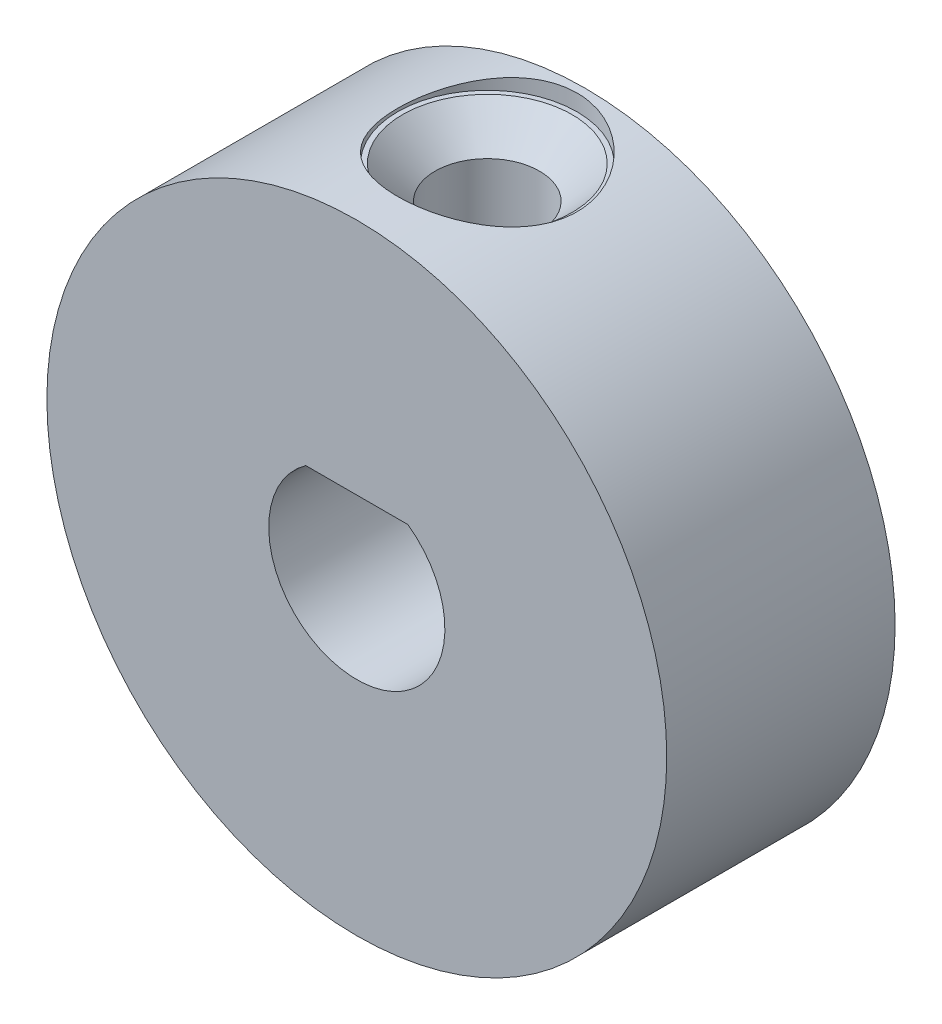
ISO-10303-21;
HEADER;
FILE_DESCRIPTION(('STEP AP214'),'2;1');
FILE_NAME('part.step','',(''),(''),'','','');
FILE_SCHEMA(('AUTOMOTIVE_DESIGN { 1 0 10303 214 1 1 1 1 }'));
ENDSEC;
DATA;
#1=APPLICATION_CONTEXT('core data for automotive mechanical design processes');
#2=APPLICATION_PROTOCOL_DEFINITION('international standard','automotive_design',2000,#1);
#3=PRODUCT_CONTEXT('',#1,'mechanical');
#4=PRODUCT('Part','Part','',(#3));
#5=PRODUCT_RELATED_PRODUCT_CATEGORY('part','',(#4));
#6=PRODUCT_DEFINITION_FORMATION('','',#4);
#7=PRODUCT_DEFINITION_CONTEXT('part definition',#1,'design');
#8=PRODUCT_DEFINITION('design','',#6,#7);
#9=PRODUCT_DEFINITION_SHAPE('','',#8);
#10=(LENGTH_UNIT() NAMED_UNIT(*) SI_UNIT(.MILLI.,.METRE.));
#11=(NAMED_UNIT(*) PLANE_ANGLE_UNIT() SI_UNIT($,.RADIAN.));
#12=(NAMED_UNIT(*) SI_UNIT($,.STERADIAN.) SOLID_ANGLE_UNIT());
#13=UNCERTAINTY_MEASURE_WITH_UNIT(LENGTH_MEASURE(1.E-05),#10,'distance_accuracy_value','');
#14=(GEOMETRIC_REPRESENTATION_CONTEXT(3) GLOBAL_UNCERTAINTY_ASSIGNED_CONTEXT((#13)) GLOBAL_UNIT_ASSIGNED_CONTEXT((#10,
#11,#12)) REPRESENTATION_CONTEXT('',''));
#15=CARTESIAN_POINT('',(0.,0.,0.));
#16=DIRECTION('',(0.,0.,1.));
#17=DIRECTION('',(1.,0.,0.));
#18=AXIS2_PLACEMENT_3D('',#15,#16,#17);
#19=CARTESIAN_POINT('',(0.,0.,7.));
#20=DIRECTION('',(0.,0.,-1.));
#21=DIRECTION('',(-1.,0.,0.));
#22=AXIS2_PLACEMENT_3D('',#19,#20,#21);
#23=CYLINDRICAL_SURFACE('',#22,9.5);
#24=CARTESIAN_POINT('',(0.,0.,0.));
#25=DIRECTION('',(0.,0.,1.));
#26=DIRECTION('',(1.,0.,0.));
#27=AXIS2_PLACEMENT_3D('',#24,#25,#26);
#28=CIRCLE('',#27,9.5);
#29=CARTESIAN_POINT('',(9.5,0.,0.));
#30=VERTEX_POINT('',#29);
#31=EDGE_CURVE('E208',#30,#30,#28,.T.);
#32=ORIENTED_EDGE('',*,*,#31,.T.);
#33=EDGE_LOOP('',(#32));
#34=FACE_BOUND('',#33,.T.);
#35=CARTESIAN_POINT('',(0.,0.,7.));
#36=DIRECTION('',(0.,0.,1.));
#37=DIRECTION('',(1.,0.,0.));
#38=AXIS2_PLACEMENT_3D('',#35,#36,#37);
#39=CIRCLE('',#38,9.5);
#40=CARTESIAN_POINT('',(9.5,0.,7.));
#41=VERTEX_POINT('',#40);
#42=EDGE_CURVE('E210',#41,#41,#39,.T.);
#43=ORIENTED_EDGE('',*,*,#42,.F.);
#44=EDGE_LOOP('',(#43));
#45=FACE_BOUND('',#44,.T.);
#46=CARTESIAN_POINT('',(0.,9.5,0.25));
#47=CARTESIAN_POINT('',(-0.151103684405143,9.49999832244704,0.250002458752218));
#48=CARTESIAN_POINT('',(-0.302232490543049,9.49636009363155,0.262495456649511));
#49=CARTESIAN_POINT('',(-0.600104468590065,9.48220118050608,0.312028709515903));
#50=CARTESIAN_POINT('',(-0.746846052747288,9.47167803530686,0.349077741658606));
#51=CARTESIAN_POINT('',(-1.0316032111177,9.44490511841537,0.446393629211872));
#52=CARTESIAN_POINT('',(-1.16963081556959,9.42866345486217,0.506627622481757));
#53=CARTESIAN_POINT('',(-1.43362680551052,9.39215081459137,0.648473022458029));
#54=CARTESIAN_POINT('',(-1.55959383673314,9.37187938616094,0.730086826040953));
#55=CARTESIAN_POINT('',(-1.79928390939948,9.3288679137925,0.91469178268505));
#56=CARTESIAN_POINT('',(-1.91263626798142,9.30607995192475,1.01815304781881));
#57=CARTESIAN_POINT('',(-2.12064810193771,9.26089657094852,1.24251316219742));
#58=CARTESIAN_POINT('',(-2.21530468820945,9.23850121299656,1.36341470154252));
#59=CARTESIAN_POINT('',(-2.3851412003241,9.1961374284627,1.62230141161262));
#60=CARTESIAN_POINT('',(-2.45987724499969,9.17622885775419,1.76058848836682));
#61=CARTESIAN_POINT('',(-2.58488523493734,9.14180519471755,2.04843649415717));
#62=CARTESIAN_POINT('',(-2.63516260005811,9.12728890766878,2.197994917057));
#63=CARTESIAN_POINT('',(-2.7085054649216,9.1057912455198,2.49999556608355));
#64=CARTESIAN_POINT('',(-2.73225075845377,9.09862204672375,2.65225898197182));
#65=CARTESIAN_POINT('',(-2.75397717672037,9.09207071188815,2.95876409294279));
#66=CARTESIAN_POINT('',(-2.751964064319,9.09268683405768,3.11300533781662));
#67=CARTESIAN_POINT('',(-2.72276662670944,9.10146952020892,3.4136343353565));
#68=CARTESIAN_POINT('',(-2.69642417137728,9.10938354042197,3.56011243495701));
#69=CARTESIAN_POINT('',(-2.62067211905444,9.13146312538767,3.84647458311347));
#70=CARTESIAN_POINT('',(-2.57126038727882,9.1456292686927,3.98635802009324));
#71=CARTESIAN_POINT('',(-2.45013108041961,9.17882509752256,4.25766325857888));
#72=CARTESIAN_POINT('',(-2.37813330895178,9.19791530942063,4.38895224019629));
#73=CARTESIAN_POINT('',(-2.21407061426739,9.23877807968907,4.63787169462001));
#74=CARTESIAN_POINT('',(-2.12200112000824,9.26055124857193,4.75549904682108));
#75=CARTESIAN_POINT('',(-1.91618685498144,9.3053597726663,4.97854309496557));
#76=CARTESIAN_POINT('',(-1.80174061950395,9.32841134979004,5.08331030255787));
#77=CARTESIAN_POINT('',(-1.55661714618187,9.37242908900899,5.27231056222138));
#78=CARTESIAN_POINT('',(-1.42593902284808,9.39339513722105,5.35654249329974));
#79=CARTESIAN_POINT('',(-1.15093833312675,9.43104916921502,5.50243927488955));
#80=CARTESIAN_POINT('',(-1.00654019019468,9.44771132340433,5.5639687806679));
#81=CARTESIAN_POINT('',(-0.708852909931513,9.47469408752444,5.66168204194399));
#82=CARTESIAN_POINT('',(-0.555566086357667,9.48501633971808,5.69787236154339));
#83=CARTESIAN_POINT('',(-0.249981074301841,9.49790021134739,5.74281889776173));
#84=CARTESIAN_POINT('',(-0.0978227914435444,9.50071098704387,5.75245622823781));
#85=CARTESIAN_POINT('',(0.205942559875614,9.49898138198389,5.74648095244813));
#86=CARTESIAN_POINT('',(0.357549694070776,9.4944419087673,5.73087146342335));
#87=CARTESIAN_POINT('',(0.65264277856964,9.47868434388847,5.67556180638035));
#88=CARTESIAN_POINT('',(0.796232011032956,9.46760695334969,5.6363688361761));
#89=CARTESIAN_POINT('',(1.0747718814908,9.44004611204558,5.5356080040606));
#90=CARTESIAN_POINT('',(1.20972150725606,9.42356202920441,5.47403752598896));
#91=CARTESIAN_POINT('',(1.47045331248785,9.3864531724936,5.32874017299851));
#92=CARTESIAN_POINT('',(1.59596781480529,9.36574512857691,5.24455478541087));
#93=CARTESIAN_POINT('',(1.83139177054953,9.32257224582277,5.05698055414273));
#94=CARTESIAN_POINT('',(1.94129756906272,9.30010699742409,4.95358722579485));
#95=CARTESIAN_POINT('',(2.14621104649743,9.25500783915003,4.72639898636426));
#96=CARTESIAN_POINT('',(2.24059318661215,9.2323936777625,4.60203477635806));
#97=CARTESIAN_POINT('',(2.40718239059994,9.19036893236844,4.3387444034156));
#98=CARTESIAN_POINT('',(2.47939018279239,9.17095824315312,4.19981871895396));
#99=CARTESIAN_POINT('',(2.59906135276599,9.13776453706624,3.91189403341437));
#100=CARTESIAN_POINT('',(2.64665229406024,9.12395259006895,3.76295157602129));
#101=CARTESIAN_POINT('',(2.71595633948743,9.10356585395778,3.45869839580935));
#102=CARTESIAN_POINT('',(2.73767754597492,9.09698879893803,3.30338968266267));
#103=CARTESIAN_POINT('',(2.75410126157507,9.09202893674775,2.99727899048027));
#104=CARTESIAN_POINT('',(2.74981852412952,9.09333835862443,2.84653569857242));
#105=CARTESIAN_POINT('',(2.7167557932435,9.10327026037628,2.54801799271784));
#106=CARTESIAN_POINT('',(2.68797665822233,9.11189248399127,2.40024347492305));
#107=CARTESIAN_POINT('',(2.6073723314937,9.13527934560716,2.11339133879243));
#108=CARTESIAN_POINT('',(2.5557982443584,9.14997694724351,1.97423729812608));
#109=CARTESIAN_POINT('',(2.43126245291443,9.18385041129181,1.7064469395777));
#110=CARTESIAN_POINT('',(2.35829688090384,9.20302708341754,1.57781252908836));
#111=CARTESIAN_POINT('',(2.19012593088046,9.24451630224843,1.3299592752244));
#112=CARTESIAN_POINT('',(2.09424562749779,9.26691363088848,1.21121254912153));
#113=CARTESIAN_POINT('',(1.88420411013172,9.31188982023244,0.991164814491644));
#114=CARTESIAN_POINT('',(1.77003826301004,9.33446872556291,0.889868240971169));
#115=CARTESIAN_POINT('',(1.5230110830886,9.37798262689348,0.704925509299319));
#116=CARTESIAN_POINT('',(1.38973368573323,9.39885802173931,0.621819693319833));
#117=CARTESIAN_POINT('',(1.11049416144361,9.43591993772834,0.479317097890563));
#118=CARTESIAN_POINT('',(0.964538760766351,9.45210892570754,0.41990783877487));
#119=CARTESIAN_POINT('',(0.683003090577126,9.47633414525845,0.332617401388523));
#120=CARTESIAN_POINT('',(0.548418661837662,9.48513842472122,0.301715738391637));
#121=CARTESIAN_POINT('',(0.275896149880622,9.49697170809105,0.260407369578417));
#122=CARTESIAN_POINT('',(0.137958545422953,9.50000153161564,0.249997755144881));
#123=CARTESIAN_POINT('',(0.,9.5,0.25));
#124=B_SPLINE_CURVE_WITH_KNOTS('',3,(#46,#47,#48,#49,#50,#51,#52,#53,#54,#55,#56,#57,#58,#59,
#60,#61,#62,#63,#64,#65,#66,#67,#68,#69,#70,#71,#72,#73,#74,#75,#76,#77,#78,#79,#80,#81,#82,#83,
#84,#85,#86,#87,#88,#89,#90,#91,#92,#93,#94,#95,#96,#97,#98,#99,#100,#101,#102,#103,#104,#105,
#106,#107,#108,#109,#110,#111,#112,#113,#114,#115,#116,#117,#118,#119,#120,#121,#122,#123),
.UNSPECIFIED.,.T.,.F.,(4,2,2,2,2,2,2,2,2,2,2,2,2,2,2,2,2,2,2,2,2,2,2,2,2,2,2,2,2,2,2,2,2,2,2,2,
2,2,4),(0.,0.452804573289335,0.905771081895445,1.35809791035428,1.81047547059563,
2.27381553554252,2.73722714561844,3.21023444408138,3.68313687990037,4.14362319086674,
4.6040064801759,5.04903287760036,5.49410046504692,5.94492368071088,6.39584967224769,
6.86424271505826,7.33266132108632,7.8038290193356,8.27487461665878,8.73008958851488,
9.18524835897753,9.63095163111836,10.0767070273173,10.532289033496,10.9879775428882,
11.4589952340737,11.9299974529659,12.3985338697172,12.8669235030808,13.3171557415863,
13.7673722033992,14.2127481976108,14.6582047680457,15.1188873659057,15.5796868753882,
16.0527270031477,16.5255176768595,16.9389895859487,17.3524028030902),.UNSPECIFIED.);
#125=CARTESIAN_POINT('',(0.,9.5,0.25));
#126=VERTEX_POINT('',#125);
#127=EDGE_CURVE('E127',#126,#126,#124,.T.);
#128=ORIENTED_EDGE('',*,*,#127,.F.);
#129=EDGE_LOOP('',(#128));
#130=FACE_BOUND('',#129,.T.);
#131=ADVANCED_FACE('F37',(#34,#45,#130),#23,.T.);
#132=CARTESIAN_POINT('',(0.,9.501,3.));
#133=DIRECTION('',(0.,-1.,0.));
#134=DIRECTION('',(0.,0.,-1.));
#135=AXIS2_PLACEMENT_3D('',#132,#133,#134);
#136=CYLINDRICAL_SURFACE('',#135,1.6);
#137=CARTESIAN_POINT('',(0.,8.,3.));
#138=DIRECTION('',(0.,1.,0.));
#139=DIRECTION('',(0.,0.,1.));
#140=AXIS2_PLACEMENT_3D('',#137,#138,#139);
#141=CIRCLE('',#140,1.6);
#142=CARTESIAN_POINT('',(0.,8.,4.6));
#143=VERTEX_POINT('',#142);
#144=EDGE_CURVE('E46',#143,#143,#141,.T.);
#145=ORIENTED_EDGE('',*,*,#144,.T.);
#146=EDGE_LOOP('',(#145));
#147=FACE_BOUND('',#146,.T.);
#148=CARTESIAN_POINT('',(0.,5.4,3.));
#149=DIRECTION('',(0.,1.,0.));
#150=DIRECTION('',(0.,0.,1.));
#151=AXIS2_PLACEMENT_3D('',#148,#149,#150);
#152=CIRCLE('',#151,1.6);
#153=CARTESIAN_POINT('',(0.,5.4,4.6));
#154=VERTEX_POINT('',#153);
#155=EDGE_CURVE('E171',#154,#154,#152,.T.);
#156=ORIENTED_EDGE('',*,*,#155,.F.);
#157=EDGE_LOOP('',(#156));
#158=FACE_BOUND('',#157,.T.);
#159=ADVANCED_FACE('F148',(#147,#158),#136,.F.);
#160=CARTESIAN_POINT('',(0.,2.2,7.));
#161=DIRECTION('',(0.,1.,0.));
#162=DIRECTION('',(0.,0.,1.));
#163=AXIS2_PLACEMENT_3D('',#160,#161,#162);
#164=PLANE('',#163);
#165=DIRECTION('',(0.,0.,-1.));
#166=VECTOR('',#165,1.);
#167=CARTESIAN_POINT('',(1.56524758424985,2.2,7.));
#168=LINE('',#167,#166);
#169=CARTESIAN_POINT('',(1.56524758424985,2.2,2.66833752096446));
#170=VERTEX_POINT('',#169);
#171=CARTESIAN_POINT('',(1.56524758424985,2.2,0.));
#172=VERTEX_POINT('',#171);
#173=EDGE_CURVE('E117',#170,#172,#168,.T.);
#174=ORIENTED_EDGE('',*,*,#173,.F.);
#175=CARTESIAN_POINT('',(0.,2.2,3.));
#176=DIRECTION('',(0.,1.,0.));
#177=DIRECTION('',(0.,0.,1.));
#178=AXIS2_PLACEMENT_3D('',#175,#176,#177);
#179=CIRCLE('',#178,1.6);
#180=CARTESIAN_POINT('',(-1.56524758424985,2.2,2.66833752096446));
#181=VERTEX_POINT('',#180);
#182=EDGE_CURVE('E104',#181,#170,#179,.F.);
#183=ORIENTED_EDGE('',*,*,#182,.F.);
#184=DIRECTION('',(0.,0.,-1.));
#185=VECTOR('',#184,1.);
#186=CARTESIAN_POINT('',(-1.56524758424985,2.2,7.));
#187=LINE('',#186,#185);
#188=CARTESIAN_POINT('',(-1.56524758424985,2.2,0.));
#189=VERTEX_POINT('',#188);
#190=EDGE_CURVE('E115',#181,#189,#187,.T.);
#191=ORIENTED_EDGE('',*,*,#190,.T.);
#192=DIRECTION('',(1.,0.,0.));
#193=VECTOR('',#192,1.);
#194=CARTESIAN_POINT('',(0.,2.2,0.));
#195=LINE('',#194,#193);
#196=EDGE_CURVE('E214',#189,#172,#195,.T.);
#197=ORIENTED_EDGE('',*,*,#196,.T.);
#198=EDGE_LOOP('',(#174,#183,#191,#197));
#199=FACE_BOUND('',#198,.T.);
#200=ADVANCED_FACE('F113',(#199),#164,.F.);
#201=CARTESIAN_POINT('',(0.,0.,7.));
#202=DIRECTION('',(0.,0.,-1.));
#203=DIRECTION('',(-1.,0.,0.));
#204=AXIS2_PLACEMENT_3D('',#201,#202,#203);
#205=CYLINDRICAL_SURFACE('',#204,2.7);
#206=CARTESIAN_POINT('',(-1.56524758424985,2.2,2.66833752096446));
#207=CARTESIAN_POINT('',(-1.57292963429452,2.19452808663043,2.70456186670789));
#208=CARTESIAN_POINT('',(-1.57936917128531,2.18989180592703,2.74118363505691));
#209=CARTESIAN_POINT('',(-1.5897018997922,2.18240605147891,2.81498245276267));
#210=CARTESIAN_POINT('',(-1.59359384556162,2.17955745192049,2.85215976470022));
#211=CARTESIAN_POINT('',(-1.59870735636453,2.1758085620884,2.92599880128177));
#212=CARTESIAN_POINT('',(-1.5999840712512,2.17486803859762,2.96265462539391));
#213=CARTESIAN_POINT('',(-1.60001562405347,2.17484482043315,3.0359488036478));
#214=CARTESIAN_POINT('',(-1.59877177873663,2.17576115571661,3.07258715691501));
#215=CARTESIAN_POINT('',(-1.59372408946355,2.17946217006362,3.14643516984341));
#216=CARTESIAN_POINT('',(-1.58986229458151,2.18228913851785,3.18363870807796));
#217=CARTESIAN_POINT('',(-1.57952635642709,2.18977849818965,3.25792201434403));
#218=CARTESIAN_POINT('',(-1.57302360387628,2.19446097604557,3.29499579154589));
#219=CARTESIAN_POINT('',(-1.56524758424985,2.2,3.33166247903554));
#220=B_SPLINE_CURVE_WITH_KNOTS('',3,(#206,#207,#208,#209,#210,#211,#212,#213,#214,#215,#216,
#217,#218,#219),.UNSPECIFIED.,.F.,.F.,(4,2,2,2,2,2,4),(0.,0.112276021034318,0.224606902990104,
0.334543500973395,0.44442268171029,0.556817184440531,0.670463181993472),.UNSPECIFIED.);
#221=CARTESIAN_POINT('',(-1.56524758424985,2.2,3.33166247903554));
#222=VERTEX_POINT('',#221);
#223=EDGE_CURVE('E101',#181,#222,#220,.T.);
#224=ORIENTED_EDGE('',*,*,#223,.T.);
#225=CARTESIAN_POINT('',(-1.56524758424985,2.2,7.));
#226=VERTEX_POINT('',#225);
#227=EDGE_CURVE('E124',#226,#222,#187,.T.);
#228=ORIENTED_EDGE('',*,*,#227,.F.);
#229=CARTESIAN_POINT('',(0.,0.,7.));
#230=DIRECTION('',(0.,0.,1.));
#231=DIRECTION('',(1.,0.,0.));
#232=AXIS2_PLACEMENT_3D('',#229,#230,#231);
#233=CIRCLE('',#232,2.7);
#234=CARTESIAN_POINT('',(1.56524758424985,2.2,7.));
#235=VERTEX_POINT('',#234);
#236=EDGE_CURVE('E204',#226,#235,#233,.T.);
#237=ORIENTED_EDGE('',*,*,#236,.T.);
#238=CARTESIAN_POINT('',(1.56524758424985,2.2,3.33166247903554));
#239=VERTEX_POINT('',#238);
#240=EDGE_CURVE('E125',#235,#239,#168,.T.);
#241=ORIENTED_EDGE('',*,*,#240,.T.);
#242=CARTESIAN_POINT('',(1.56524758424985,2.2,3.33166247903554));
#243=CARTESIAN_POINT('',(1.57292963429452,2.19452808663043,3.29543813329211));
#244=CARTESIAN_POINT('',(1.57936917128531,2.18989180592703,3.25881636494309));
#245=CARTESIAN_POINT('',(1.5897018997922,2.18240605147891,3.18501754723733));
#246=CARTESIAN_POINT('',(1.59359384556162,2.17955745192049,3.14784023529978));
#247=CARTESIAN_POINT('',(1.59870735636453,2.1758085620884,3.07400119871823));
#248=CARTESIAN_POINT('',(1.5999840712512,2.17486803859762,3.03734537460609));
#249=CARTESIAN_POINT('',(1.60001562405347,2.17484482043315,2.9640511963522));
#250=CARTESIAN_POINT('',(1.59877177873663,2.17576115571661,2.92741284308499));
#251=CARTESIAN_POINT('',(1.59372408946355,2.17946217006362,2.85356483015659));
#252=CARTESIAN_POINT('',(1.58986229458151,2.18228913851785,2.81636129192204));
#253=CARTESIAN_POINT('',(1.57952635642709,2.18977849818965,2.74207798565597));
#254=CARTESIAN_POINT('',(1.57302360387628,2.19446097604557,2.70500420845411));
#255=CARTESIAN_POINT('',(1.56524758424985,2.2,2.66833752096446));
#256=B_SPLINE_CURVE_WITH_KNOTS('',3,(#242,#243,#244,#245,#246,#247,#248,#249,#250,#251,#252,
#253,#254,#255),.UNSPECIFIED.,.F.,.F.,(4,2,2,2,2,2,4),(0.,0.112276021034318,0.224606902990104,
0.334543500973395,0.44442268171029,0.556817184440528,0.670463181993466),.UNSPECIFIED.);
#257=EDGE_CURVE('E53',#239,#170,#256,.T.);
#258=ORIENTED_EDGE('',*,*,#257,.T.);
#259=ORIENTED_EDGE('',*,*,#173,.T.);
#260=CARTESIAN_POINT('',(0.,0.,0.));
#261=DIRECTION('',(0.,0.,1.));
#262=DIRECTION('',(1.,0.,0.));
#263=AXIS2_PLACEMENT_3D('',#260,#261,#262);
#264=CIRCLE('',#263,2.7);
#265=EDGE_CURVE('E123',#189,#172,#264,.T.);
#266=ORIENTED_EDGE('',*,*,#265,.F.);
#267=ORIENTED_EDGE('',*,*,#190,.F.);
#268=EDGE_LOOP('',(#224,#228,#237,#241,#258,#259,#266,#267));
#269=FACE_BOUND('',#268,.T.);
#270=ADVANCED_FACE('F121',(#269),#205,.F.);
#271=ORIENTED_EDGE('',*,*,#227,.T.);
#272=EDGE_CURVE('E105',#239,#222,#179,.F.);
#273=ORIENTED_EDGE('',*,*,#272,.F.);
#274=ORIENTED_EDGE('',*,*,#240,.F.);
#275=DIRECTION('',(1.,0.,0.));
#276=VECTOR('',#275,1.);
#277=CARTESIAN_POINT('',(0.,2.2,7.));
#278=LINE('',#277,#276);
#279=EDGE_CURVE('E207',#226,#235,#278,.T.);
#280=ORIENTED_EDGE('',*,*,#279,.F.);
#281=EDGE_LOOP('',(#271,#273,#274,#280));
#282=FACE_BOUND('',#281,.T.);
#283=ADVANCED_FACE('F231',(#282),#164,.F.);
#284=CARTESIAN_POINT('',(0.,0.,7.));
#285=DIRECTION('',(0.,0.,1.));
#286=DIRECTION('',(1.,0.,0.));
#287=AXIS2_PLACEMENT_3D('',#284,#285,#286);
#288=PLANE('',#287);
#289=ORIENTED_EDGE('',*,*,#236,.F.);
#290=ORIENTED_EDGE('',*,*,#279,.T.);
#291=EDGE_LOOP('',(#289,#290));
#292=FACE_BOUND('',#291,.T.);
#293=ORIENTED_EDGE('',*,*,#42,.T.);
#294=EDGE_LOOP('',(#293));
#295=FACE_BOUND('',#294,.T.);
#296=ADVANCED_FACE('F223',(#292,#295),#288,.T.);
#297=CARTESIAN_POINT('',(0.,0.,0.));
#298=DIRECTION('',(0.,0.,1.));
#299=DIRECTION('',(1.,0.,0.));
#300=AXIS2_PLACEMENT_3D('',#297,#298,#299);
#301=PLANE('',#300);
#302=DIRECTION('',(1.,0.,0.));
#303=VECTOR('',#302,1.);
#304=CARTESIAN_POINT('',(2.75,5.4,0.));
#305=LINE('',#304,#303);
#306=CARTESIAN_POINT('',(-2.75,5.4,0.));
#307=VERTEX_POINT('',#306);
#308=CARTESIAN_POINT('',(2.75,5.4,0.));
#309=VERTEX_POINT('',#308);
#310=EDGE_CURVE('E189',#307,#309,#305,.T.);
#311=ORIENTED_EDGE('',*,*,#310,.F.);
#312=DIRECTION('',(0.,1.,0.));
#313=VECTOR('',#312,1.);
#314=CARTESIAN_POINT('',(-2.75,3.2,0.));
#315=LINE('',#314,#313);
#316=CARTESIAN_POINT('',(-2.75,3.2,0.));
#317=VERTEX_POINT('',#316);
#318=EDGE_CURVE('E61',#317,#307,#315,.T.);
#319=ORIENTED_EDGE('',*,*,#318,.F.);
#320=DIRECTION('',(-1.,0.,0.));
#321=VECTOR('',#320,1.);
#322=CARTESIAN_POINT('',(2.75,3.2,0.));
#323=LINE('',#322,#321);
#324=CARTESIAN_POINT('',(2.75,3.2,0.));
#325=VERTEX_POINT('',#324);
#326=EDGE_CURVE('E178',#325,#317,#323,.T.);
#327=ORIENTED_EDGE('',*,*,#326,.F.);
#328=DIRECTION('',(0.,-1.,0.));
#329=VECTOR('',#328,1.);
#330=CARTESIAN_POINT('',(2.75,3.2,0.));
#331=LINE('',#330,#329);
#332=EDGE_CURVE('E192',#309,#325,#331,.T.);
#333=ORIENTED_EDGE('',*,*,#332,.F.);
#334=EDGE_LOOP('',(#311,#319,#327,#333));
#335=FACE_BOUND('',#334,.T.);
#336=ORIENTED_EDGE('',*,*,#265,.T.);
#337=ORIENTED_EDGE('',*,*,#196,.F.);
#338=EDGE_LOOP('',(#336,#337));
#339=FACE_BOUND('',#338,.T.);
#340=ORIENTED_EDGE('',*,*,#31,.F.);
#341=EDGE_LOOP('',(#340));
#342=FACE_BOUND('',#341,.T.);
#343=ADVANCED_FACE('F220',(#335,#339,#342),#301,.F.);
#344=CARTESIAN_POINT('',(-2.75,3.2,6.));
#345=DIRECTION('',(-1.,0.,0.));
#346=DIRECTION('',(0.,0.,1.));
#347=AXIS2_PLACEMENT_3D('',#344,#345,#346);
#348=PLANE('',#347);
#349=ORIENTED_EDGE('',*,*,#318,.T.);
#350=DIRECTION('',(0.,0.,-1.));
#351=VECTOR('',#350,1.);
#352=CARTESIAN_POINT('',(-2.75,5.4,6.));
#353=LINE('',#352,#351);
#354=CARTESIAN_POINT('',(-2.75,5.4,6.));
#355=VERTEX_POINT('',#354);
#356=EDGE_CURVE('E187',#355,#307,#353,.T.);
#357=ORIENTED_EDGE('',*,*,#356,.F.);
#358=DIRECTION('',(0.,1.,0.));
#359=VECTOR('',#358,1.);
#360=CARTESIAN_POINT('',(-2.75,3.2,6.));
#361=LINE('',#360,#359);
#362=CARTESIAN_POINT('',(-2.75,3.2,6.));
#363=VERTEX_POINT('',#362);
#364=EDGE_CURVE('E174',#363,#355,#361,.T.);
#365=ORIENTED_EDGE('',*,*,#364,.F.);
#366=DIRECTION('',(0.,0.,-1.));
#367=VECTOR('',#366,1.);
#368=CARTESIAN_POINT('',(-2.75,3.2,6.));
#369=LINE('',#368,#367);
#370=EDGE_CURVE('E197',#363,#317,#369,.T.);
#371=ORIENTED_EDGE('',*,*,#370,.T.);
#372=EDGE_LOOP('',(#349,#357,#365,#371));
#373=FACE_BOUND('',#372,.T.);
#374=ADVANCED_FACE('F222',(#373),#348,.F.);
#375=CARTESIAN_POINT('',(2.75,3.2,6.));
#376=DIRECTION('',(0.,-1.,0.));
#377=DIRECTION('',(0.,0.,-1.));
#378=AXIS2_PLACEMENT_3D('',#375,#376,#377);
#379=PLANE('',#378);
#380=CARTESIAN_POINT('',(0.,3.2,3.));
#381=DIRECTION('',(0.,1.,0.));
#382=DIRECTION('',(0.,0.,1.));
#383=AXIS2_PLACEMENT_3D('',#380,#381,#382);
#384=CIRCLE('',#383,1.6);
#385=CARTESIAN_POINT('',(0.,3.2,4.6));
#386=VERTEX_POINT('',#385);
#387=EDGE_CURVE('E118',#386,#386,#384,.T.);
#388=ORIENTED_EDGE('',*,*,#387,.F.);
#389=EDGE_LOOP('',(#388));
#390=FACE_BOUND('',#389,.T.);
#391=ORIENTED_EDGE('',*,*,#326,.T.);
#392=ORIENTED_EDGE('',*,*,#370,.F.);
#393=DIRECTION('',(-1.,0.,0.));
#394=VECTOR('',#393,1.);
#395=CARTESIAN_POINT('',(2.75,3.2,6.));
#396=LINE('',#395,#394);
#397=CARTESIAN_POINT('',(2.75,3.2,6.));
#398=VERTEX_POINT('',#397);
#399=EDGE_CURVE('E184',#398,#363,#396,.T.);
#400=ORIENTED_EDGE('',*,*,#399,.F.);
#401=DIRECTION('',(0.,0.,-1.));
#402=VECTOR('',#401,1.);
#403=CARTESIAN_POINT('',(2.75,3.2,6.));
#404=LINE('',#403,#402);
#405=EDGE_CURVE('E199',#398,#325,#404,.T.);
#406=ORIENTED_EDGE('',*,*,#405,.T.);
#407=EDGE_LOOP('',(#391,#392,#400,#406));
#408=FACE_BOUND('',#407,.T.);
#409=ADVANCED_FACE('F229',(#390,#408),#379,.F.);
#410=CARTESIAN_POINT('',(2.75,3.2,6.));
#411=DIRECTION('',(1.,0.,0.));
#412=DIRECTION('',(0.,0.,-1.));
#413=AXIS2_PLACEMENT_3D('',#410,#411,#412);
#414=PLANE('',#413);
#415=ORIENTED_EDGE('',*,*,#332,.T.);
#416=ORIENTED_EDGE('',*,*,#405,.F.);
#417=DIRECTION('',(0.,-1.,0.));
#418=VECTOR('',#417,1.);
#419=CARTESIAN_POINT('',(2.75,3.2,6.));
#420=LINE('',#419,#418);
#421=CARTESIAN_POINT('',(2.75,5.4,6.));
#422=VERTEX_POINT('',#421);
#423=EDGE_CURVE('E181',#422,#398,#420,.T.);
#424=ORIENTED_EDGE('',*,*,#423,.F.);
#425=DIRECTION('',(0.,0.,-1.));
#426=VECTOR('',#425,1.);
#427=CARTESIAN_POINT('',(2.75,5.4,6.));
#428=LINE('',#427,#426);
#429=EDGE_CURVE('E201',#422,#309,#428,.T.);
#430=ORIENTED_EDGE('',*,*,#429,.T.);
#431=EDGE_LOOP('',(#415,#416,#424,#430));
#432=FACE_BOUND('',#431,.T.);
#433=ADVANCED_FACE('F285',(#432),#414,.F.);
#434=CARTESIAN_POINT('',(2.75,5.4,6.));
#435=DIRECTION('',(0.,1.,0.));
#436=DIRECTION('',(0.,0.,1.));
#437=AXIS2_PLACEMENT_3D('',#434,#435,#436);
#438=PLANE('',#437);
#439=ORIENTED_EDGE('',*,*,#155,.T.);
#440=EDGE_LOOP('',(#439));
#441=FACE_BOUND('',#440,.T.);
#442=ORIENTED_EDGE('',*,*,#310,.T.);
#443=ORIENTED_EDGE('',*,*,#429,.F.);
#444=DIRECTION('',(1.,0.,0.));
#445=VECTOR('',#444,1.);
#446=CARTESIAN_POINT('',(2.75,5.4,6.));
#447=LINE('',#446,#445);
#448=EDGE_CURVE('E177',#355,#422,#447,.T.);
#449=ORIENTED_EDGE('',*,*,#448,.F.);
#450=ORIENTED_EDGE('',*,*,#356,.T.);
#451=EDGE_LOOP('',(#442,#443,#449,#450));
#452=FACE_BOUND('',#451,.T.);
#453=ADVANCED_FACE('F289',(#441,#452),#438,.F.);
#454=CARTESIAN_POINT('',(0.,0.,6.));
#455=DIRECTION('',(0.,0.,1.));
#456=DIRECTION('',(1.,0.,0.));
#457=AXIS2_PLACEMENT_3D('',#454,#455,#456);
#458=PLANE('',#457);
#459=ORIENTED_EDGE('',*,*,#364,.T.);
#460=ORIENTED_EDGE('',*,*,#448,.T.);
#461=ORIENTED_EDGE('',*,*,#423,.T.);
#462=ORIENTED_EDGE('',*,*,#399,.T.);
#463=EDGE_LOOP('',(#459,#460,#461,#462));
#464=FACE_BOUND('',#463,.T.);
#465=ADVANCED_FACE('F155',(#464),#458,.F.);
#466=CARTESIAN_POINT('',(0.,-9.501,3.));
#467=DIRECTION('',(0.,1.,0.));
#468=DIRECTION('',(0.,0.,1.));
#469=AXIS2_PLACEMENT_3D('',#466,#467,#468);
#470=CYLINDRICAL_SURFACE('',#469,1.6);
#471=ORIENTED_EDGE('',*,*,#387,.T.);
#472=EDGE_LOOP('',(#471));
#473=FACE_BOUND('',#472,.T.);
#474=ORIENTED_EDGE('',*,*,#182,.T.);
#475=ORIENTED_EDGE('',*,*,#257,.F.);
#476=ORIENTED_EDGE('',*,*,#272,.T.);
#477=ORIENTED_EDGE('',*,*,#223,.F.);
#478=EDGE_LOOP('',(#474,#475,#476,#477));
#479=FACE_BOUND('',#478,.T.);
#480=ADVANCED_FACE('F103',(#473,#479),#470,.F.);
#481=CARTESIAN_POINT('',(0.,9.5,3.));
#482=DIRECTION('',(0.,-1.,0.));
#483=DIRECTION('',(0.,0.,-1.));
#484=AXIS2_PLACEMENT_3D('',#481,#482,#483);
#485=CYLINDRICAL_SURFACE('',#484,2.75);
#486=CARTESIAN_POINT('',(0.,9.,3.));
#487=DIRECTION('',(0.,1.,0.));
#488=DIRECTION('',(0.,0.,1.));
#489=AXIS2_PLACEMENT_3D('',#486,#487,#488);
#490=CIRCLE('',#489,2.75);
#491=CARTESIAN_POINT('',(0.,9.,5.75));
#492=VERTEX_POINT('',#491);
#493=EDGE_CURVE('E109',#492,#492,#490,.T.);
#494=ORIENTED_EDGE('',*,*,#493,.F.);
#495=EDGE_LOOP('',(#494));
#496=FACE_BOUND('',#495,.T.);
#497=ORIENTED_EDGE('',*,*,#127,.T.);
#498=EDGE_LOOP('',(#497));
#499=FACE_BOUND('',#498,.T.);
#500=ADVANCED_FACE('F141',(#496,#499),#485,.F.);
#501=CARTESIAN_POINT('',(0.,9.,3.));
#502=DIRECTION('',(0.,1.,0.));
#503=DIRECTION('',(0.,0.,1.));
#504=AXIS2_PLACEMENT_3D('',#501,#502,#503);
#505=PLANE('',#504);
#506=CARTESIAN_POINT('',(0.,9.,3.));
#507=DIRECTION('',(0.,1.,0.));
#508=DIRECTION('',(0.,0.,1.));
#509=AXIS2_PLACEMENT_3D('',#506,#507,#508);
#510=CIRCLE('',#509,2.6);
#511=CARTESIAN_POINT('',(0.,9.,5.6));
#512=VERTEX_POINT('',#511);
#513=EDGE_CURVE('E11',#512,#512,#510,.F.);
#514=ORIENTED_EDGE('',*,*,#513,.T.);
#515=EDGE_LOOP('',(#514));
#516=FACE_BOUND('',#515,.T.);
#517=ORIENTED_EDGE('',*,*,#493,.T.);
#518=EDGE_LOOP('',(#517));
#519=FACE_BOUND('',#518,.T.);
#520=ADVANCED_FACE('F146',(#516,#519),#505,.T.);
#521=CARTESIAN_POINT('',(0.,8.,3.));
#522=DIRECTION('',(0.,1.,0.));
#523=DIRECTION('',(0.,0.,1.));
#524=AXIS2_PLACEMENT_3D('',#521,#522,#523);
#525=CONICAL_SURFACE('',#524,1.6,0.785398163397449);
#526=ORIENTED_EDGE('',*,*,#513,.F.);
#527=EDGE_LOOP('',(#526));
#528=FACE_BOUND('',#527,.T.);
#529=ORIENTED_EDGE('',*,*,#144,.F.);
#530=EDGE_LOOP('',(#529));
#531=FACE_BOUND('',#530,.T.);
#532=ADVANCED_FACE('F40',(#528,#531),#525,.F.);
#533=CLOSED_SHELL('',(#131,#159,#200,#270,#283,#296,#343,#374,#409,#433,#453,#465,#480,#500,
#520,#532));
#534=MANIFOLD_SOLID_BREP('B2',#533);
#535=ADVANCED_BREP_SHAPE_REPRESENTATION('',(#18,#534),#14);
#536=SHAPE_DEFINITION_REPRESENTATION(#9,#535);
ENDSEC;
END-ISO-10303-21;
